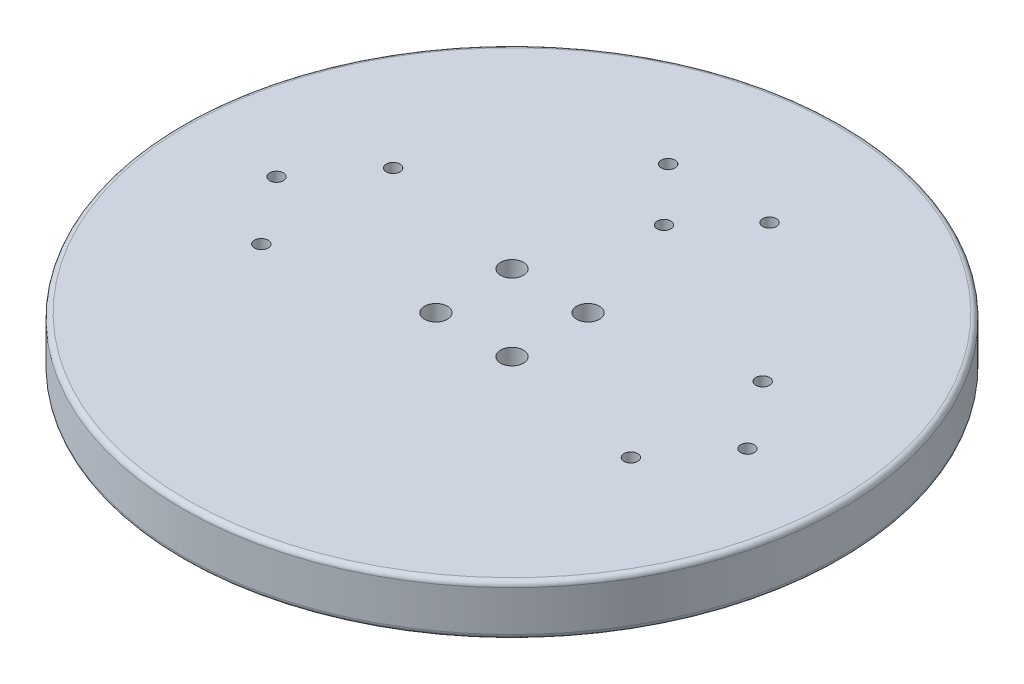
ISO-10303-21;
HEADER;
FILE_DESCRIPTION(('STEP AP214'),'2;1');
FILE_NAME('part.step','',(''),(''),'','','');
FILE_SCHEMA(('AUTOMOTIVE_DESIGN { 1 0 10303 214 1 1 1 1 }'));
ENDSEC;
DATA;
#1=APPLICATION_CONTEXT('core data for automotive mechanical design processes');
#2=APPLICATION_PROTOCOL_DEFINITION('international standard','automotive_design',2000,#1);
#3=PRODUCT_CONTEXT('',#1,'mechanical');
#4=PRODUCT('Part','Part','',(#3));
#5=PRODUCT_RELATED_PRODUCT_CATEGORY('part','',(#4));
#6=PRODUCT_DEFINITION_FORMATION('','',#4);
#7=PRODUCT_DEFINITION_CONTEXT('part definition',#1,'design');
#8=PRODUCT_DEFINITION('design','',#6,#7);
#9=PRODUCT_DEFINITION_SHAPE('','',#8);
#10=(LENGTH_UNIT() NAMED_UNIT(*) SI_UNIT(.MILLI.,.METRE.));
#11=(NAMED_UNIT(*) PLANE_ANGLE_UNIT() SI_UNIT($,.RADIAN.));
#12=(NAMED_UNIT(*) SI_UNIT($,.STERADIAN.) SOLID_ANGLE_UNIT());
#13=UNCERTAINTY_MEASURE_WITH_UNIT(LENGTH_MEASURE(1.E-05),#10,'distance_accuracy_value','');
#14=(GEOMETRIC_REPRESENTATION_CONTEXT(3) GLOBAL_UNCERTAINTY_ASSIGNED_CONTEXT((#13)) GLOBAL_UNIT_ASSIGNED_CONTEXT((#10,
#11,#12)) REPRESENTATION_CONTEXT('',''));
#15=CARTESIAN_POINT('',(0.,0.,0.));
#16=DIRECTION('',(0.,0.,1.));
#17=DIRECTION('',(1.,0.,0.));
#18=AXIS2_PLACEMENT_3D('',#15,#16,#17);
#19=CARTESIAN_POINT('',(0.,0.,0.));
#20=DIRECTION('',(0.,1.,0.));
#21=DIRECTION('',(0.,0.,1.));
#22=AXIS2_PLACEMENT_3D('',#19,#20,#21);
#23=PLANE('',#22);
#24=CARTESIAN_POINT('',(-7.5,0.,7.5));
#25=DIRECTION('',(0.,-1.,0.));
#26=DIRECTION('',(0.,0.,-1.));
#27=AXIS2_PLACEMENT_3D('',#24,#25,#26);
#28=CIRCLE('',#27,2.2479);
#29=CARTESIAN_POINT('',(-7.5,0.,5.2521));
#30=VERTEX_POINT('',#29);
#31=EDGE_CURVE('E128',#30,#30,#28,.T.);
#32=ORIENTED_EDGE('',*,*,#31,.F.);
#33=EDGE_LOOP('',(#32));
#34=FACE_BOUND('',#33,.T.);
#35=CARTESIAN_POINT('',(7.5,0.,7.5));
#36=DIRECTION('',(0.,-1.,0.));
#37=DIRECTION('',(0.,0.,-1.));
#38=AXIS2_PLACEMENT_3D('',#35,#36,#37);
#39=CIRCLE('',#38,2.2479);
#40=CARTESIAN_POINT('',(7.5,0.,5.2521));
#41=VERTEX_POINT('',#40);
#42=EDGE_CURVE('E122',#41,#41,#39,.T.);
#43=ORIENTED_EDGE('',*,*,#42,.F.);
#44=EDGE_LOOP('',(#43));
#45=FACE_BOUND('',#44,.T.);
#46=CARTESIAN_POINT('',(-7.5,0.,-7.5));
#47=DIRECTION('',(0.,-1.,0.));
#48=DIRECTION('',(0.,0.,-1.));
#49=AXIS2_PLACEMENT_3D('',#46,#47,#48);
#50=CIRCLE('',#49,2.2479);
#51=CARTESIAN_POINT('',(-7.5,0.,-9.7479));
#52=VERTEX_POINT('',#51);
#53=EDGE_CURVE('E116',#52,#52,#50,.T.);
#54=ORIENTED_EDGE('',*,*,#53,.F.);
#55=EDGE_LOOP('',(#54));
#56=FACE_BOUND('',#55,.T.);
#57=CARTESIAN_POINT('',(7.5,0.,-7.5));
#58=DIRECTION('',(0.,-1.,0.));
#59=DIRECTION('',(0.,0.,-1.));
#60=AXIS2_PLACEMENT_3D('',#57,#58,#59);
#61=CIRCLE('',#60,2.2479);
#62=CARTESIAN_POINT('',(7.5,0.,-9.7479));
#63=VERTEX_POINT('',#62);
#64=EDGE_CURVE('E110',#63,#63,#61,.T.);
#65=ORIENTED_EDGE('',*,*,#64,.F.);
#66=EDGE_LOOP('',(#65));
#67=FACE_BOUND('',#66,.T.);
#68=CARTESIAN_POINT('',(-46.445,0.,0.));
#69=DIRECTION('',(0.,-1.,0.));
#70=DIRECTION('',(0.,0.,-1.));
#71=AXIS2_PLACEMENT_3D('',#68,#69,#70);
#72=CIRCLE('',#71,1.35255);
#73=CARTESIAN_POINT('',(-46.445,0.,-1.35255));
#74=VERTEX_POINT('',#73);
#75=EDGE_CURVE('E104',#74,#74,#72,.T.);
#76=ORIENTED_EDGE('',*,*,#75,.F.);
#77=EDGE_LOOP('',(#76));
#78=FACE_BOUND('',#77,.T.);
#79=CARTESIAN_POINT('',(46.445,0.,0.));
#80=DIRECTION('',(0.,-1.,0.));
#81=DIRECTION('',(0.,0.,-1.));
#82=AXIS2_PLACEMENT_3D('',#79,#80,#81);
#83=CIRCLE('',#82,1.35255);
#84=CARTESIAN_POINT('',(46.445,0.,-1.35255));
#85=VERTEX_POINT('',#84);
#86=EDGE_CURVE('E98',#85,#85,#83,.T.);
#87=ORIENTED_EDGE('',*,*,#86,.F.);
#88=EDGE_LOOP('',(#87));
#89=FACE_BOUND('',#88,.T.);
#90=CARTESIAN_POINT('',(-36.445,0.,13.));
#91=DIRECTION('',(0.,-1.,0.));
#92=DIRECTION('',(0.,0.,-1.));
#93=AXIS2_PLACEMENT_3D('',#90,#91,#92);
#94=CIRCLE('',#93,1.35255);
#95=CARTESIAN_POINT('',(-36.445,0.,11.64745));
#96=VERTEX_POINT('',#95);
#97=EDGE_CURVE('E86',#96,#96,#94,.T.);
#98=ORIENTED_EDGE('',*,*,#97,.F.);
#99=EDGE_LOOP('',(#98));
#100=FACE_BOUND('',#99,.T.);
#101=CARTESIAN_POINT('',(36.445,0.,13.));
#102=DIRECTION('',(0.,-1.,0.));
#103=DIRECTION('',(0.,0.,-1.));
#104=AXIS2_PLACEMENT_3D('',#101,#102,#103);
#105=CIRCLE('',#104,1.35255);
#106=CARTESIAN_POINT('',(36.445,0.,11.64745));
#107=VERTEX_POINT('',#106);
#108=EDGE_CURVE('E80',#107,#107,#105,.T.);
#109=ORIENTED_EDGE('',*,*,#108,.F.);
#110=EDGE_LOOP('',(#109));
#111=FACE_BOUND('',#110,.T.);
#112=CARTESIAN_POINT('',(36.445,0.,-13.));
#113=DIRECTION('',(0.,-1.,0.));
#114=DIRECTION('',(0.,0.,-1.));
#115=AXIS2_PLACEMENT_3D('',#112,#113,#114);
#116=CIRCLE('',#115,1.35255);
#117=CARTESIAN_POINT('',(36.445,0.,-14.35255));
#118=VERTEX_POINT('',#117);
#119=EDGE_CURVE('E74',#118,#118,#116,.T.);
#120=ORIENTED_EDGE('',*,*,#119,.F.);
#121=EDGE_LOOP('',(#120));
#122=FACE_BOUND('',#121,.T.);
#123=CARTESIAN_POINT('',(0.,0.,-29.98));
#124=DIRECTION('',(0.,-1.,0.));
#125=DIRECTION('',(0.,0.,-1.));
#126=AXIS2_PLACEMENT_3D('',#123,#124,#125);
#127=CIRCLE('',#126,1.35255);
#128=CARTESIAN_POINT('',(0.,0.,-31.33255));
#129=VERTEX_POINT('',#128);
#130=EDGE_CURVE('E68',#129,#129,#127,.T.);
#131=ORIENTED_EDGE('',*,*,#130,.F.);
#132=EDGE_LOOP('',(#131));
#133=FACE_BOUND('',#132,.T.);
#134=CARTESIAN_POINT('',(-10.,0.,-40.8));
#135=DIRECTION('',(0.,-1.,0.));
#136=DIRECTION('',(0.,0.,-1.));
#137=AXIS2_PLACEMENT_3D('',#134,#135,#136);
#138=CIRCLE('',#137,1.35255);
#139=CARTESIAN_POINT('',(-10.,0.,-42.15255));
#140=VERTEX_POINT('',#139);
#141=EDGE_CURVE('E62',#140,#140,#138,.T.);
#142=ORIENTED_EDGE('',*,*,#141,.F.);
#143=EDGE_LOOP('',(#142));
#144=FACE_BOUND('',#143,.T.);
#145=CARTESIAN_POINT('',(10.,0.,-40.8));
#146=DIRECTION('',(0.,-1.,0.));
#147=DIRECTION('',(0.,0.,-1.));
#148=AXIS2_PLACEMENT_3D('',#145,#146,#147);
#149=CIRCLE('',#148,1.35255);
#150=CARTESIAN_POINT('',(10.,0.,-42.15255));
#151=VERTEX_POINT('',#150);
#152=EDGE_CURVE('E56',#151,#151,#149,.T.);
#153=ORIENTED_EDGE('',*,*,#152,.F.);
#154=EDGE_LOOP('',(#153));
#155=FACE_BOUND('',#154,.T.);
#156=CARTESIAN_POINT('',(0.,0.,0.));
#157=DIRECTION('',(0.,1.,0.));
#158=DIRECTION('',(0.,0.,1.));
#159=AXIS2_PLACEMENT_3D('',#156,#157,#158);
#160=CIRCLE('',#159,64.);
#161=CARTESIAN_POINT('',(0.,0.,64.));
#162=VERTEX_POINT('',#161);
#163=EDGE_CURVE('E40',#162,#162,#160,.F.);
#164=ORIENTED_EDGE('',*,*,#163,.T.);
#165=EDGE_LOOP('',(#164));
#166=FACE_BOUND('',#165,.T.);
#167=CARTESIAN_POINT('',(-36.445,0.,-13.));
#168=DIRECTION('',(0.,-1.,0.));
#169=DIRECTION('',(0.,0.,-1.));
#170=AXIS2_PLACEMENT_3D('',#167,#168,#169);
#171=CIRCLE('',#170,1.35255);
#172=CARTESIAN_POINT('',(-36.445,0.,-14.35255));
#173=VERTEX_POINT('',#172);
#174=EDGE_CURVE('E92',#173,#173,#171,.T.);
#175=ORIENTED_EDGE('',*,*,#174,.F.);
#176=EDGE_LOOP('',(#175));
#177=FACE_BOUND('',#176,.T.);
#178=ADVANCED_FACE('F33',(#34,#45,#56,#67,#78,#89,#100,#111,#122,#133,#144,#155,#166,#177),#23,.F.);
#179=CARTESIAN_POINT('',(0.,10.,0.));
#180=DIRECTION('',(0.,1.,0.));
#181=DIRECTION('',(0.,0.,1.));
#182=AXIS2_PLACEMENT_3D('',#179,#180,#181);
#183=PLANE('',#182);
#184=CARTESIAN_POINT('',(-7.5,10.,7.5));
#185=DIRECTION('',(0.,-1.,0.));
#186=DIRECTION('',(0.,0.,-1.));
#187=AXIS2_PLACEMENT_3D('',#184,#185,#186);
#188=CIRCLE('',#187,2.2479);
#189=CARTESIAN_POINT('',(-7.5,10.,5.2521));
#190=VERTEX_POINT('',#189);
#191=EDGE_CURVE('E125',#190,#190,#188,.T.);
#192=ORIENTED_EDGE('',*,*,#191,.T.);
#193=EDGE_LOOP('',(#192));
#194=FACE_BOUND('',#193,.T.);
#195=CARTESIAN_POINT('',(7.5,10.,7.5));
#196=DIRECTION('',(0.,-1.,0.));
#197=DIRECTION('',(0.,0.,-1.));
#198=AXIS2_PLACEMENT_3D('',#195,#196,#197);
#199=CIRCLE('',#198,2.2479);
#200=CARTESIAN_POINT('',(7.5,10.,5.2521));
#201=VERTEX_POINT('',#200);
#202=EDGE_CURVE('E119',#201,#201,#199,.T.);
#203=ORIENTED_EDGE('',*,*,#202,.T.);
#204=EDGE_LOOP('',(#203));
#205=FACE_BOUND('',#204,.T.);
#206=CARTESIAN_POINT('',(-7.5,10.,-7.5));
#207=DIRECTION('',(0.,-1.,0.));
#208=DIRECTION('',(0.,0.,-1.));
#209=AXIS2_PLACEMENT_3D('',#206,#207,#208);
#210=CIRCLE('',#209,2.2479);
#211=CARTESIAN_POINT('',(-7.5,10.,-9.7479));
#212=VERTEX_POINT('',#211);
#213=EDGE_CURVE('E113',#212,#212,#210,.T.);
#214=ORIENTED_EDGE('',*,*,#213,.T.);
#215=EDGE_LOOP('',(#214));
#216=FACE_BOUND('',#215,.T.);
#217=CARTESIAN_POINT('',(7.5,10.,-7.5));
#218=DIRECTION('',(0.,-1.,0.));
#219=DIRECTION('',(0.,0.,-1.));
#220=AXIS2_PLACEMENT_3D('',#217,#218,#219);
#221=CIRCLE('',#220,2.2479);
#222=CARTESIAN_POINT('',(7.5,10.,-9.7479));
#223=VERTEX_POINT('',#222);
#224=EDGE_CURVE('E107',#223,#223,#221,.T.);
#225=ORIENTED_EDGE('',*,*,#224,.T.);
#226=EDGE_LOOP('',(#225));
#227=FACE_BOUND('',#226,.T.);
#228=CARTESIAN_POINT('',(-46.445,10.,0.));
#229=DIRECTION('',(0.,-1.,0.));
#230=DIRECTION('',(0.,0.,-1.));
#231=AXIS2_PLACEMENT_3D('',#228,#229,#230);
#232=CIRCLE('',#231,1.35254999999999);
#233=CARTESIAN_POINT('',(-46.445,10.,-1.35254999999999));
#234=VERTEX_POINT('',#233);
#235=EDGE_CURVE('E101',#234,#234,#232,.T.);
#236=ORIENTED_EDGE('',*,*,#235,.T.);
#237=EDGE_LOOP('',(#236));
#238=FACE_BOUND('',#237,.T.);
#239=CARTESIAN_POINT('',(46.445,10.,0.));
#240=DIRECTION('',(0.,-1.,0.));
#241=DIRECTION('',(0.,0.,-1.));
#242=AXIS2_PLACEMENT_3D('',#239,#240,#241);
#243=CIRCLE('',#242,1.35254999999999);
#244=CARTESIAN_POINT('',(46.445,10.,-1.35254999999999));
#245=VERTEX_POINT('',#244);
#246=EDGE_CURVE('E95',#245,#245,#243,.T.);
#247=ORIENTED_EDGE('',*,*,#246,.T.);
#248=EDGE_LOOP('',(#247));
#249=FACE_BOUND('',#248,.T.);
#250=CARTESIAN_POINT('',(0.,10.,0.));
#251=DIRECTION('',(0.,1.,0.));
#252=DIRECTION('',(0.,0.,1.));
#253=AXIS2_PLACEMENT_3D('',#250,#251,#252);
#254=CIRCLE('',#253,64.);
#255=CARTESIAN_POINT('',(0.,10.,64.));
#256=VERTEX_POINT('',#255);
#257=EDGE_CURVE('E10',#256,#256,#254,.T.);
#258=ORIENTED_EDGE('',*,*,#257,.T.);
#259=EDGE_LOOP('',(#258));
#260=FACE_BOUND('',#259,.T.);
#261=CARTESIAN_POINT('',(10.,10.,-40.8));
#262=DIRECTION('',(0.,-1.,0.));
#263=DIRECTION('',(0.,0.,-1.));
#264=AXIS2_PLACEMENT_3D('',#261,#262,#263);
#265=CIRCLE('',#264,1.35255);
#266=CARTESIAN_POINT('',(10.,10.,-42.15255));
#267=VERTEX_POINT('',#266);
#268=EDGE_CURVE('E53',#267,#267,#265,.T.);
#269=ORIENTED_EDGE('',*,*,#268,.T.);
#270=EDGE_LOOP('',(#269));
#271=FACE_BOUND('',#270,.T.);
#272=CARTESIAN_POINT('',(-10.,10.,-40.8));
#273=DIRECTION('',(0.,-1.,0.));
#274=DIRECTION('',(0.,0.,-1.));
#275=AXIS2_PLACEMENT_3D('',#272,#273,#274);
#276=CIRCLE('',#275,1.35255);
#277=CARTESIAN_POINT('',(-10.,10.,-42.15255));
#278=VERTEX_POINT('',#277);
#279=EDGE_CURVE('E59',#278,#278,#276,.T.);
#280=ORIENTED_EDGE('',*,*,#279,.T.);
#281=EDGE_LOOP('',(#280));
#282=FACE_BOUND('',#281,.T.);
#283=CARTESIAN_POINT('',(0.,10.,-29.98));
#284=DIRECTION('',(0.,-1.,0.));
#285=DIRECTION('',(0.,0.,-1.));
#286=AXIS2_PLACEMENT_3D('',#283,#284,#285);
#287=CIRCLE('',#286,1.35255);
#288=CARTESIAN_POINT('',(0.,10.,-31.33255));
#289=VERTEX_POINT('',#288);
#290=EDGE_CURVE('E65',#289,#289,#287,.T.);
#291=ORIENTED_EDGE('',*,*,#290,.T.);
#292=EDGE_LOOP('',(#291));
#293=FACE_BOUND('',#292,.T.);
#294=CARTESIAN_POINT('',(36.445,10.,-13.));
#295=DIRECTION('',(0.,-1.,0.));
#296=DIRECTION('',(0.,0.,-1.));
#297=AXIS2_PLACEMENT_3D('',#294,#295,#296);
#298=CIRCLE('',#297,1.35254999999999);
#299=CARTESIAN_POINT('',(36.445,10.,-14.35255));
#300=VERTEX_POINT('',#299);
#301=EDGE_CURVE('E71',#300,#300,#298,.T.);
#302=ORIENTED_EDGE('',*,*,#301,.T.);
#303=EDGE_LOOP('',(#302));
#304=FACE_BOUND('',#303,.T.);
#305=CARTESIAN_POINT('',(36.445,10.,13.));
#306=DIRECTION('',(0.,-1.,0.));
#307=DIRECTION('',(0.,0.,-1.));
#308=AXIS2_PLACEMENT_3D('',#305,#306,#307);
#309=CIRCLE('',#308,1.35254999999999);
#310=CARTESIAN_POINT('',(36.445,10.,11.64745));
#311=VERTEX_POINT('',#310);
#312=EDGE_CURVE('E77',#311,#311,#309,.T.);
#313=ORIENTED_EDGE('',*,*,#312,.T.);
#314=EDGE_LOOP('',(#313));
#315=FACE_BOUND('',#314,.T.);
#316=CARTESIAN_POINT('',(-36.445,10.,13.));
#317=DIRECTION('',(0.,-1.,0.));
#318=DIRECTION('',(0.,0.,-1.));
#319=AXIS2_PLACEMENT_3D('',#316,#317,#318);
#320=CIRCLE('',#319,1.35254999999999);
#321=CARTESIAN_POINT('',(-36.445,10.,11.64745));
#322=VERTEX_POINT('',#321);
#323=EDGE_CURVE('E83',#322,#322,#320,.T.);
#324=ORIENTED_EDGE('',*,*,#323,.T.);
#325=EDGE_LOOP('',(#324));
#326=FACE_BOUND('',#325,.T.);
#327=CARTESIAN_POINT('',(-36.445,10.,-13.));
#328=DIRECTION('',(0.,-1.,0.));
#329=DIRECTION('',(0.,0.,-1.));
#330=AXIS2_PLACEMENT_3D('',#327,#328,#329);
#331=CIRCLE('',#330,1.35254999999999);
#332=CARTESIAN_POINT('',(-36.445,10.,-14.35255));
#333=VERTEX_POINT('',#332);
#334=EDGE_CURVE('E89',#333,#333,#331,.T.);
#335=ORIENTED_EDGE('',*,*,#334,.T.);
#336=EDGE_LOOP('',(#335));
#337=FACE_BOUND('',#336,.T.);
#338=ADVANCED_FACE('F136',(#194,#205,#216,#227,#238,#249,#260,#271,#282,#293,#304,#315,#326,
#337),#183,.T.);
#339=CARTESIAN_POINT('',(0.,10.,0.));
#340=DIRECTION('',(0.,-1.,0.));
#341=DIRECTION('',(0.,0.,-1.));
#342=AXIS2_PLACEMENT_3D('',#339,#340,#341);
#343=CYLINDRICAL_SURFACE('',#342,65.);
#344=CARTESIAN_POINT('',(0.,0.999999999999999,0.));
#345=DIRECTION('',(0.,1.,0.));
#346=DIRECTION('',(0.,0.,1.));
#347=AXIS2_PLACEMENT_3D('',#344,#345,#346);
#348=CIRCLE('',#347,65.);
#349=CARTESIAN_POINT('',(0.,0.999999999999999,65.));
#350=VERTEX_POINT('',#349);
#351=EDGE_CURVE('E44',#350,#350,#348,.T.);
#352=ORIENTED_EDGE('',*,*,#351,.T.);
#353=EDGE_LOOP('',(#352));
#354=FACE_BOUND('',#353,.T.);
#355=CARTESIAN_POINT('',(0.,9.,0.));
#356=DIRECTION('',(0.,1.,0.));
#357=DIRECTION('',(0.,0.,1.));
#358=AXIS2_PLACEMENT_3D('',#355,#356,#357);
#359=CIRCLE('',#358,65.);
#360=CARTESIAN_POINT('',(0.,9.,65.));
#361=VERTEX_POINT('',#360);
#362=EDGE_CURVE('E48',#361,#361,#359,.F.);
#363=ORIENTED_EDGE('',*,*,#362,.T.);
#364=EDGE_LOOP('',(#363));
#365=FACE_BOUND('',#364,.T.);
#366=ADVANCED_FACE('F201',(#354,#365),#343,.T.);
#367=CARTESIAN_POINT('',(0.,0.999999999999999,0.));
#368=DIRECTION('',(0.,1.,0.));
#369=DIRECTION('',(0.,0.,1.));
#370=AXIS2_PLACEMENT_3D('',#367,#368,#369);
#371=TOROIDAL_SURFACE('',#370,64.,1.);
#372=ORIENTED_EDGE('',*,*,#163,.F.);
#373=EDGE_LOOP('',(#372));
#374=FACE_BOUND('',#373,.T.);
#375=ORIENTED_EDGE('',*,*,#351,.F.);
#376=EDGE_LOOP('',(#375));
#377=FACE_BOUND('',#376,.T.);
#378=ADVANCED_FACE('F205',(#374,#377),#371,.T.);
#379=CARTESIAN_POINT('',(0.,9.,0.));
#380=DIRECTION('',(0.,1.,0.));
#381=DIRECTION('',(0.,0.,1.));
#382=AXIS2_PLACEMENT_3D('',#379,#380,#381);
#383=TOROIDAL_SURFACE('',#382,64.,1.);
#384=ORIENTED_EDGE('',*,*,#362,.F.);
#385=EDGE_LOOP('',(#384));
#386=FACE_BOUND('',#385,.T.);
#387=ORIENTED_EDGE('',*,*,#257,.F.);
#388=EDGE_LOOP('',(#387));
#389=FACE_BOUND('',#388,.T.);
#390=ADVANCED_FACE('F35',(#386,#389),#383,.T.);
#391=CARTESIAN_POINT('',(10.,0.,-40.8));
#392=DIRECTION('',(0.,-1.,0.));
#393=DIRECTION('',(0.,0.,-1.));
#394=AXIS2_PLACEMENT_3D('',#391,#392,#393);
#395=CYLINDRICAL_SURFACE('',#394,1.35255);
#396=ORIENTED_EDGE('',*,*,#268,.F.);
#397=EDGE_LOOP('',(#396));
#398=FACE_BOUND('',#397,.T.);
#399=ORIENTED_EDGE('',*,*,#152,.T.);
#400=EDGE_LOOP('',(#399));
#401=FACE_BOUND('',#400,.T.);
#402=ADVANCED_FACE('F195',(#398,#401),#395,.F.);
#403=CARTESIAN_POINT('',(-10.,0.,-40.8));
#404=DIRECTION('',(0.,-1.,0.));
#405=DIRECTION('',(0.,0.,-1.));
#406=AXIS2_PLACEMENT_3D('',#403,#404,#405);
#407=CYLINDRICAL_SURFACE('',#406,1.35255);
#408=ORIENTED_EDGE('',*,*,#279,.F.);
#409=EDGE_LOOP('',(#408));
#410=FACE_BOUND('',#409,.T.);
#411=ORIENTED_EDGE('',*,*,#141,.T.);
#412=EDGE_LOOP('',(#411));
#413=FACE_BOUND('',#412,.T.);
#414=ADVANCED_FACE('F191',(#410,#413),#407,.F.);
#415=CARTESIAN_POINT('',(0.,0.,-29.98));
#416=DIRECTION('',(0.,-1.,0.));
#417=DIRECTION('',(0.,0.,-1.));
#418=AXIS2_PLACEMENT_3D('',#415,#416,#417);
#419=CYLINDRICAL_SURFACE('',#418,1.35255);
#420=ORIENTED_EDGE('',*,*,#290,.F.);
#421=EDGE_LOOP('',(#420));
#422=FACE_BOUND('',#421,.T.);
#423=ORIENTED_EDGE('',*,*,#130,.T.);
#424=EDGE_LOOP('',(#423));
#425=FACE_BOUND('',#424,.T.);
#426=ADVANCED_FACE('F187',(#422,#425),#419,.F.);
#427=CARTESIAN_POINT('',(36.445,0.,-13.));
#428=DIRECTION('',(0.,-1.,0.));
#429=DIRECTION('',(0.,0.,-1.));
#430=AXIS2_PLACEMENT_3D('',#427,#428,#429);
#431=CYLINDRICAL_SURFACE('',#430,1.35255);
#432=ORIENTED_EDGE('',*,*,#301,.F.);
#433=EDGE_LOOP('',(#432));
#434=FACE_BOUND('',#433,.T.);
#435=ORIENTED_EDGE('',*,*,#119,.T.);
#436=EDGE_LOOP('',(#435));
#437=FACE_BOUND('',#436,.T.);
#438=ADVANCED_FACE('F183',(#434,#437),#431,.F.);
#439=CARTESIAN_POINT('',(36.445,0.,13.));
#440=DIRECTION('',(0.,-1.,0.));
#441=DIRECTION('',(0.,0.,-1.));
#442=AXIS2_PLACEMENT_3D('',#439,#440,#441);
#443=CYLINDRICAL_SURFACE('',#442,1.35255);
#444=ORIENTED_EDGE('',*,*,#312,.F.);
#445=EDGE_LOOP('',(#444));
#446=FACE_BOUND('',#445,.T.);
#447=ORIENTED_EDGE('',*,*,#108,.T.);
#448=EDGE_LOOP('',(#447));
#449=FACE_BOUND('',#448,.T.);
#450=ADVANCED_FACE('F175',(#446,#449),#443,.F.);
#451=CARTESIAN_POINT('',(-36.445,0.,13.));
#452=DIRECTION('',(0.,-1.,0.));
#453=DIRECTION('',(0.,0.,-1.));
#454=AXIS2_PLACEMENT_3D('',#451,#452,#453);
#455=CYLINDRICAL_SURFACE('',#454,1.35255);
#456=ORIENTED_EDGE('',*,*,#323,.F.);
#457=EDGE_LOOP('',(#456));
#458=FACE_BOUND('',#457,.T.);
#459=ORIENTED_EDGE('',*,*,#97,.T.);
#460=EDGE_LOOP('',(#459));
#461=FACE_BOUND('',#460,.T.);
#462=ADVANCED_FACE('F165',(#458,#461),#455,.F.);
#463=CARTESIAN_POINT('',(-36.445,0.,-13.));
#464=DIRECTION('',(0.,-1.,0.));
#465=DIRECTION('',(0.,0.,-1.));
#466=AXIS2_PLACEMENT_3D('',#463,#464,#465);
#467=CYLINDRICAL_SURFACE('',#466,1.35255);
#468=ORIENTED_EDGE('',*,*,#334,.F.);
#469=EDGE_LOOP('',(#468));
#470=FACE_BOUND('',#469,.T.);
#471=ORIENTED_EDGE('',*,*,#174,.T.);
#472=EDGE_LOOP('',(#471));
#473=FACE_BOUND('',#472,.T.);
#474=ADVANCED_FACE('F162',(#470,#473),#467,.F.);
#475=CARTESIAN_POINT('',(46.445,0.,0.));
#476=DIRECTION('',(0.,-1.,0.));
#477=DIRECTION('',(0.,0.,-1.));
#478=AXIS2_PLACEMENT_3D('',#475,#476,#477);
#479=CYLINDRICAL_SURFACE('',#478,1.35255);
#480=ORIENTED_EDGE('',*,*,#246,.F.);
#481=EDGE_LOOP('',(#480));
#482=FACE_BOUND('',#481,.T.);
#483=ORIENTED_EDGE('',*,*,#86,.T.);
#484=EDGE_LOOP('',(#483));
#485=FACE_BOUND('',#484,.T.);
#486=ADVANCED_FACE('F164',(#482,#485),#479,.F.);
#487=CARTESIAN_POINT('',(-46.445,0.,0.));
#488=DIRECTION('',(0.,-1.,0.));
#489=DIRECTION('',(0.,0.,-1.));
#490=AXIS2_PLACEMENT_3D('',#487,#488,#489);
#491=CYLINDRICAL_SURFACE('',#490,1.35255);
#492=ORIENTED_EDGE('',*,*,#235,.F.);
#493=EDGE_LOOP('',(#492));
#494=FACE_BOUND('',#493,.T.);
#495=ORIENTED_EDGE('',*,*,#75,.T.);
#496=EDGE_LOOP('',(#495));
#497=FACE_BOUND('',#496,.T.);
#498=ADVANCED_FACE('F172',(#494,#497),#491,.F.);
#499=CARTESIAN_POINT('',(7.5,0.,-7.5));
#500=DIRECTION('',(0.,-1.,0.));
#501=DIRECTION('',(0.,0.,-1.));
#502=AXIS2_PLACEMENT_3D('',#499,#500,#501);
#503=CYLINDRICAL_SURFACE('',#502,2.2479);
#504=ORIENTED_EDGE('',*,*,#224,.F.);
#505=EDGE_LOOP('',(#504));
#506=FACE_BOUND('',#505,.T.);
#507=ORIENTED_EDGE('',*,*,#64,.T.);
#508=EDGE_LOOP('',(#507));
#509=FACE_BOUND('',#508,.T.);
#510=ADVANCED_FACE('F263',(#506,#509),#503,.F.);
#511=CARTESIAN_POINT('',(-7.5,0.,-7.5));
#512=DIRECTION('',(0.,-1.,0.));
#513=DIRECTION('',(0.,0.,-1.));
#514=AXIS2_PLACEMENT_3D('',#511,#512,#513);
#515=CYLINDRICAL_SURFACE('',#514,2.2479);
#516=ORIENTED_EDGE('',*,*,#213,.F.);
#517=EDGE_LOOP('',(#516));
#518=FACE_BOUND('',#517,.T.);
#519=ORIENTED_EDGE('',*,*,#53,.T.);
#520=EDGE_LOOP('',(#519));
#521=FACE_BOUND('',#520,.T.);
#522=ADVANCED_FACE('F273',(#518,#521),#515,.F.);
#523=CARTESIAN_POINT('',(7.5,0.,7.5));
#524=DIRECTION('',(0.,-1.,0.));
#525=DIRECTION('',(0.,0.,-1.));
#526=AXIS2_PLACEMENT_3D('',#523,#524,#525);
#527=CYLINDRICAL_SURFACE('',#526,2.2479);
#528=ORIENTED_EDGE('',*,*,#202,.F.);
#529=EDGE_LOOP('',(#528));
#530=FACE_BOUND('',#529,.T.);
#531=ORIENTED_EDGE('',*,*,#42,.T.);
#532=EDGE_LOOP('',(#531));
#533=FACE_BOUND('',#532,.T.);
#534=ADVANCED_FACE('F282',(#530,#533),#527,.F.);
#535=CARTESIAN_POINT('',(-7.5,0.,7.5));
#536=DIRECTION('',(0.,-1.,0.));
#537=DIRECTION('',(0.,0.,-1.));
#538=AXIS2_PLACEMENT_3D('',#535,#536,#537);
#539=CYLINDRICAL_SURFACE('',#538,2.2479);
#540=ORIENTED_EDGE('',*,*,#191,.F.);
#541=EDGE_LOOP('',(#540));
#542=FACE_BOUND('',#541,.T.);
#543=ORIENTED_EDGE('',*,*,#31,.T.);
#544=EDGE_LOOP('',(#543));
#545=FACE_BOUND('',#544,.T.);
#546=ADVANCED_FACE('F132',(#542,#545),#539,.F.);
#547=CLOSED_SHELL('',(#178,#338,#366,#378,#390,#402,#414,#426,#438,#450,#462,#474,#486,#498,
#510,#522,#534,#546));
#548=MANIFOLD_SOLID_BREP('B2',#547);
#549=ADVANCED_BREP_SHAPE_REPRESENTATION('',(#18,#548),#14);
#550=SHAPE_DEFINITION_REPRESENTATION(#9,#549);
ENDSEC;
END-ISO-10303-21;
